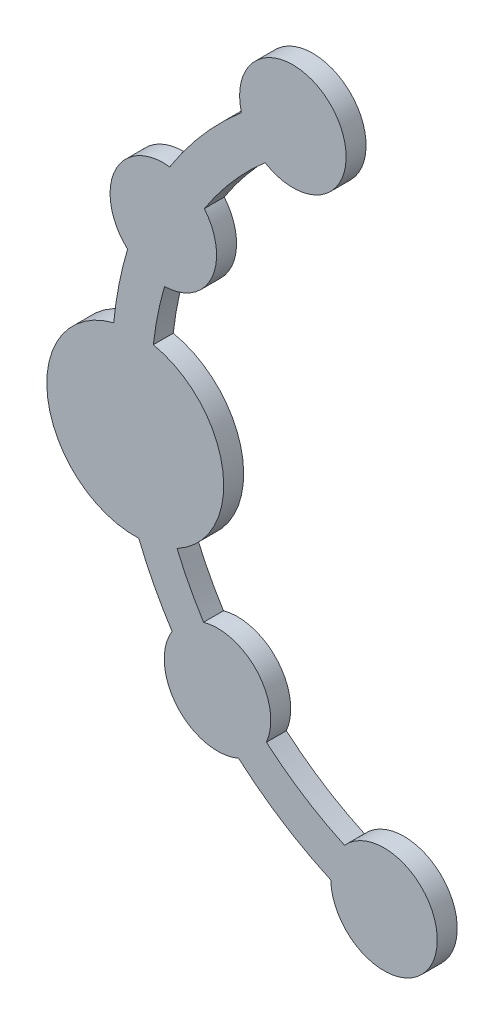
ISO-10303-21;
HEADER;
FILE_DESCRIPTION(('STEP AP214'),'2;1');
FILE_NAME('part.step','',(''),(''),'','','');
FILE_SCHEMA(('AUTOMOTIVE_DESIGN { 1 0 10303 214 1 1 1 1 }'));
ENDSEC;
DATA;
#1=APPLICATION_CONTEXT('core data for automotive mechanical design processes');
#2=APPLICATION_PROTOCOL_DEFINITION('international standard','automotive_design',2000,#1);
#3=PRODUCT_CONTEXT('',#1,'mechanical');
#4=PRODUCT('Part','Part','',(#3));
#5=PRODUCT_RELATED_PRODUCT_CATEGORY('part','',(#4));
#6=PRODUCT_DEFINITION_FORMATION('','',#4);
#7=PRODUCT_DEFINITION_CONTEXT('part definition',#1,'design');
#8=PRODUCT_DEFINITION('design','',#6,#7);
#9=PRODUCT_DEFINITION_SHAPE('','',#8);
#10=(LENGTH_UNIT() NAMED_UNIT(*) SI_UNIT(.MILLI.,.METRE.));
#11=(NAMED_UNIT(*) PLANE_ANGLE_UNIT() SI_UNIT($,.RADIAN.));
#12=(NAMED_UNIT(*) SI_UNIT($,.STERADIAN.) SOLID_ANGLE_UNIT());
#13=UNCERTAINTY_MEASURE_WITH_UNIT(LENGTH_MEASURE(1.E-05),#10,'distance_accuracy_value','');
#14=(GEOMETRIC_REPRESENTATION_CONTEXT(3) GLOBAL_UNCERTAINTY_ASSIGNED_CONTEXT((#13)) GLOBAL_UNIT_ASSIGNED_CONTEXT((#10,
#11,#12)) REPRESENTATION_CONTEXT('',''));
#15=CARTESIAN_POINT('',(0.,0.,0.));
#16=DIRECTION('',(0.,0.,1.));
#17=DIRECTION('',(1.,0.,0.));
#18=AXIS2_PLACEMENT_3D('',#15,#16,#17);
#19=CARTESIAN_POINT('',(0.,0.,0.));
#20=DIRECTION('',(0.,0.,1.));
#21=DIRECTION('',(1.,0.,0.));
#22=AXIS2_PLACEMENT_3D('',#19,#20,#21);
#23=CYLINDRICAL_SURFACE('',#22,37.75);
#24=CARTESIAN_POINT('',(0.,0.,2.03));
#25=DIRECTION('',(0.,0.,1.));
#26=DIRECTION('',(1.,0.,0.));
#27=AXIS2_PLACEMENT_3D('',#24,#25,#26);
#28=CIRCLE('',#27,37.75);
#29=CARTESIAN_POINT('',(-36.1659087125496,10.8207923460127,2.03));
#30=VERTEX_POINT('',#29);
#31=CARTESIAN_POINT('',(-37.5750307406949,3.6303670387208,2.03));
#32=VERTEX_POINT('',#31);
#33=EDGE_CURVE('E51',#30,#32,#28,.T.);
#34=ORIENTED_EDGE('',*,*,#33,.F.);
#35=DIRECTION('',(0.,0.,-1.));
#36=VECTOR('',#35,1.);
#37=CARTESIAN_POINT('',(-36.1659087125496,10.8207923460127,1.015));
#38=LINE('',#37,#36);
#39=CARTESIAN_POINT('',(-36.1659087125496,10.8207923460127,0.));
#40=VERTEX_POINT('',#39);
#41=EDGE_CURVE('E191',#30,#40,#38,.T.);
#42=ORIENTED_EDGE('',*,*,#41,.T.);
#43=CARTESIAN_POINT('',(0.,0.,0.));
#44=DIRECTION('',(0.,0.,1.));
#45=DIRECTION('',(1.,0.,0.));
#46=AXIS2_PLACEMENT_3D('',#43,#44,#45);
#47=CIRCLE('',#46,37.75);
#48=CARTESIAN_POINT('',(-37.5750307406949,3.6303670387208,0.));
#49=VERTEX_POINT('',#48);
#50=EDGE_CURVE('E158',#40,#49,#47,.T.);
#51=ORIENTED_EDGE('',*,*,#50,.T.);
#52=DIRECTION('',(0.,0.,-1.));
#53=VECTOR('',#52,1.);
#54=CARTESIAN_POINT('',(-37.5750307406949,3.6303670387208,1.015));
#55=LINE('',#54,#53);
#56=EDGE_CURVE('E219',#49,#32,#55,.F.);
#57=ORIENTED_EDGE('',*,*,#56,.T.);
#58=EDGE_LOOP('',(#34,#42,#51,#57));
#59=FACE_BOUND('',#58,.T.);
#60=ADVANCED_FACE('F36',(#59),#23,.T.);
#61=CARTESIAN_POINT('',(-24.5781736222649,28.6526766881177,0.));
#62=VERTEX_POINT('',#61);
#63=CARTESIAN_POINT('',(-31.8794195866251,20.2179402219885,0.));
#64=VERTEX_POINT('',#63);
#65=EDGE_CURVE('E150',#62,#64,#47,.T.);
#66=ORIENTED_EDGE('',*,*,#65,.T.);
#67=DIRECTION('',(0.,0.,-1.));
#68=VECTOR('',#67,1.);
#69=CARTESIAN_POINT('',(-31.8794195866251,20.2179402219885,1.015));
#70=LINE('',#69,#68);
#71=CARTESIAN_POINT('',(-31.8794195866251,20.2179402219885,2.03));
#72=VERTEX_POINT('',#71);
#73=EDGE_CURVE('E59',#64,#72,#70,.F.);
#74=ORIENTED_EDGE('',*,*,#73,.T.);
#75=CARTESIAN_POINT('',(-24.5781736222649,28.6526766881177,2.03));
#76=VERTEX_POINT('',#75);
#77=EDGE_CURVE('E164',#76,#72,#28,.T.);
#78=ORIENTED_EDGE('',*,*,#77,.F.);
#79=DIRECTION('',(0.,0.,1.));
#80=VECTOR('',#79,1.);
#81=CARTESIAN_POINT('',(-24.5781736222649,28.6526766881177,0.));
#82=LINE('',#81,#80);
#83=EDGE_CURVE('E162',#62,#76,#82,.T.);
#84=ORIENTED_EDGE('',*,*,#83,.F.);
#85=EDGE_LOOP('',(#66,#74,#78,#84));
#86=FACE_BOUND('',#85,.T.);
#87=ADVANCED_FACE('F163',(#86),#23,.T.);
#88=CARTESIAN_POINT('',(0.,0.,0.));
#89=DIRECTION('',(0.,0.,1.));
#90=DIRECTION('',(1.,0.,0.));
#91=AXIS2_PLACEMENT_3D('',#88,#89,#90);
#92=CYLINDRICAL_SURFACE('',#91,33.75);
#93=CARTESIAN_POINT('',(0.,0.,0.));
#94=DIRECTION('',(0.,0.,-1.));
#95=DIRECTION('',(1.,0.,0.));
#96=AXIS2_PLACEMENT_3D('',#93,#94,#95);
#97=CIRCLE('',#96,33.75);
#98=CARTESIAN_POINT('',(-33.5453464398065,3.71109582648624,0.));
#99=VERTEX_POINT('',#98);
#100=CARTESIAN_POINT('',(-32.4093475244958,9.41789217587786,0.));
#101=VERTEX_POINT('',#100);
#102=EDGE_CURVE('E229',#99,#101,#97,.T.);
#103=ORIENTED_EDGE('',*,*,#102,.T.);
#104=DIRECTION('',(0.,0.,-1.));
#105=VECTOR('',#104,1.);
#106=CARTESIAN_POINT('',(-32.4093475244958,9.41789217587786,1.015));
#107=LINE('',#106,#105);
#108=CARTESIAN_POINT('',(-32.4093475244958,9.41789217587786,2.03));
#109=VERTEX_POINT('',#108);
#110=EDGE_CURVE('E188',#101,#109,#107,.F.);
#111=ORIENTED_EDGE('',*,*,#110,.T.);
#112=CARTESIAN_POINT('',(0.,0.,2.03));
#113=DIRECTION('',(0.,0.,-1.));
#114=DIRECTION('',(1.,0.,0.));
#115=AXIS2_PLACEMENT_3D('',#112,#113,#114);
#116=CIRCLE('',#115,33.75);
#117=CARTESIAN_POINT('',(-33.5453464398065,3.71109582648624,2.03));
#118=VERTEX_POINT('',#117);
#119=EDGE_CURVE('E237',#118,#109,#116,.T.);
#120=ORIENTED_EDGE('',*,*,#119,.F.);
#121=DIRECTION('',(0.,0.,-1.));
#122=VECTOR('',#121,1.);
#123=CARTESIAN_POINT('',(-33.5453464398065,3.71109582648624,1.015));
#124=LINE('',#123,#122);
#125=EDGE_CURVE('E44',#118,#99,#124,.T.);
#126=ORIENTED_EDGE('',*,*,#125,.T.);
#127=EDGE_LOOP('',(#103,#111,#120,#126));
#128=FACE_BOUND('',#127,.T.);
#129=ADVANCED_FACE('F252',(#128),#92,.F.);
#130=CARTESIAN_POINT('',(-28.3574490931425,18.3007535618027,2.03));
#131=VERTEX_POINT('',#130);
#132=CARTESIAN_POINT('',(-22.1760107652679,25.4418365402092,2.03));
#133=VERTEX_POINT('',#132);
#134=EDGE_CURVE('E231',#131,#133,#116,.T.);
#135=ORIENTED_EDGE('',*,*,#134,.F.);
#136=DIRECTION('',(0.,0.,-1.));
#137=VECTOR('',#136,1.);
#138=CARTESIAN_POINT('',(-28.3574490931425,18.3007535618027,1.015));
#139=LINE('',#138,#137);
#140=CARTESIAN_POINT('',(-28.3574490931425,18.3007535618027,0.));
#141=VERTEX_POINT('',#140);
#142=EDGE_CURVE('E185',#131,#141,#139,.T.);
#143=ORIENTED_EDGE('',*,*,#142,.T.);
#144=CARTESIAN_POINT('',(-22.1760107652679,25.4418365402092,0.));
#145=VERTEX_POINT('',#144);
#146=EDGE_CURVE('E157',#141,#145,#97,.T.);
#147=ORIENTED_EDGE('',*,*,#146,.T.);
#148=DIRECTION('',(0.,0.,1.));
#149=VECTOR('',#148,1.);
#150=CARTESIAN_POINT('',(-22.1760107652679,25.4418365402092,0.));
#151=LINE('',#150,#149);
#152=EDGE_CURVE('E169',#145,#133,#151,.T.);
#153=ORIENTED_EDGE('',*,*,#152,.T.);
#154=EDGE_LOOP('',(#135,#143,#147,#153));
#155=FACE_BOUND('',#154,.T.);
#156=ADVANCED_FACE('F263',(#155),#92,.F.);
#157=CARTESIAN_POINT('',(-24.8740100130373,-28.396234360762,2.03));
#158=VERTEX_POINT('',#157);
#159=CARTESIAN_POINT('',(-15.4883469459397,-34.4263505019368,2.03));
#160=VERTEX_POINT('',#159);
#161=EDGE_CURVE('E223',#158,#160,#28,.T.);
#162=ORIENTED_EDGE('',*,*,#161,.F.);
#163=DIRECTION('',(0.,0.,-1.));
#164=VECTOR('',#163,1.);
#165=CARTESIAN_POINT('',(-24.8740100130373,-28.396234360762,1.015));
#166=LINE('',#165,#164);
#167=CARTESIAN_POINT('',(-24.8740100130373,-28.396234360762,0.));
#168=VERTEX_POINT('',#167);
#169=EDGE_CURVE('E208',#158,#168,#166,.T.);
#170=ORIENTED_EDGE('',*,*,#169,.T.);
#171=CARTESIAN_POINT('',(-15.4883469459397,-34.4263505019368,0.));
#172=VERTEX_POINT('',#171);
#173=EDGE_CURVE('E235',#168,#172,#47,.T.);
#174=ORIENTED_EDGE('',*,*,#173,.T.);
#175=DIRECTION('',(0.,0.,1.));
#176=VECTOR('',#175,1.);
#177=CARTESIAN_POINT('',(-15.4883469459397,-34.4263505019368,0.));
#178=LINE('',#177,#176);
#179=EDGE_CURVE('E227',#172,#160,#178,.T.);
#180=ORIENTED_EDGE('',*,*,#179,.T.);
#181=EDGE_LOOP('',(#162,#170,#174,#180));
#182=FACE_BOUND('',#181,.T.);
#183=ADVANCED_FACE('F294',(#182),#23,.T.);
#184=CARTESIAN_POINT('',(-35.021248964734,-14.0916507531984,0.));
#185=VERTEX_POINT('',#184);
#186=CARTESIAN_POINT('',(-31.6393033547216,-20.5916726670736,0.));
#187=VERTEX_POINT('',#186);
#188=EDGE_CURVE('E160',#185,#187,#47,.T.);
#189=ORIENTED_EDGE('',*,*,#188,.T.);
#190=DIRECTION('',(0.,0.,-1.));
#191=VECTOR('',#190,1.);
#192=CARTESIAN_POINT('',(-31.6393033547216,-20.5916726670736,1.015));
#193=LINE('',#192,#191);
#194=CARTESIAN_POINT('',(-31.6393033547216,-20.5916726670736,2.03));
#195=VERTEX_POINT('',#194);
#196=EDGE_CURVE('E206',#187,#195,#193,.F.);
#197=ORIENTED_EDGE('',*,*,#196,.T.);
#198=CARTESIAN_POINT('',(-35.021248964734,-14.0916507531984,2.03));
#199=VERTEX_POINT('',#198);
#200=EDGE_CURVE('E232',#199,#195,#28,.T.);
#201=ORIENTED_EDGE('',*,*,#200,.F.);
#202=DIRECTION('',(0.,0.,-1.));
#203=VECTOR('',#202,1.);
#204=CARTESIAN_POINT('',(-35.021248964734,-14.0916507531984,1.015));
#205=LINE('',#204,#203);
#206=EDGE_CURVE('E221',#199,#185,#205,.T.);
#207=ORIENTED_EDGE('',*,*,#206,.T.);
#208=EDGE_LOOP('',(#189,#197,#201,#207));
#209=FACE_BOUND('',#208,.T.);
#210=ADVANCED_FACE('F286',(#209),#23,.T.);
#211=CARTESIAN_POINT('',(-14.0904718331514,-30.6679165174155,0.));
#212=VERTEX_POINT('',#211);
#213=CARTESIAN_POINT('',(-22.0366357753982,-25.5626521257564,0.));
#214=VERTEX_POINT('',#213);
#215=EDGE_CURVE('E225',#212,#214,#97,.T.);
#216=ORIENTED_EDGE('',*,*,#215,.T.);
#217=DIRECTION('',(0.,0.,-1.));
#218=VECTOR('',#217,1.);
#219=CARTESIAN_POINT('',(-22.0366357753982,-25.5626521257564,1.015));
#220=LINE('',#219,#218);
#221=CARTESIAN_POINT('',(-22.0366357753982,-25.5626521257564,2.03));
#222=VERTEX_POINT('',#221);
#223=EDGE_CURVE('E204',#214,#222,#220,.F.);
#224=ORIENTED_EDGE('',*,*,#223,.T.);
#225=CARTESIAN_POINT('',(-14.0904718331514,-30.6679165174155,2.03));
#226=VERTEX_POINT('',#225);
#227=EDGE_CURVE('E233',#226,#222,#116,.T.);
#228=ORIENTED_EDGE('',*,*,#227,.F.);
#229=DIRECTION('',(0.,0.,1.));
#230=VECTOR('',#229,1.);
#231=CARTESIAN_POINT('',(-14.0904718331514,-30.6679165174155,0.));
#232=LINE('',#231,#230);
#233=EDGE_CURVE('E240',#212,#226,#232,.T.);
#234=ORIENTED_EDGE('',*,*,#233,.F.);
#235=EDGE_LOOP('',(#216,#224,#228,#234));
#236=FACE_BOUND('',#235,.T.);
#237=ADVANCED_FACE('F299',(#236),#92,.F.);
#238=CARTESIAN_POINT('',(-28.4316785886476,-18.1852179704241,2.03));
#239=VERTEX_POINT('',#238);
#240=CARTESIAN_POINT('',(-31.1327234183602,-13.0313480713197,2.03));
#241=VERTEX_POINT('',#240);
#242=EDGE_CURVE('E236',#239,#241,#116,.T.);
#243=ORIENTED_EDGE('',*,*,#242,.F.);
#244=DIRECTION('',(0.,0.,-1.));
#245=VECTOR('',#244,1.);
#246=CARTESIAN_POINT('',(-28.4316785886476,-18.1852179704241,1.015));
#247=LINE('',#246,#245);
#248=CARTESIAN_POINT('',(-28.4316785886476,-18.1852179704241,0.));
#249=VERTEX_POINT('',#248);
#250=EDGE_CURVE('E201',#239,#249,#247,.T.);
#251=ORIENTED_EDGE('',*,*,#250,.T.);
#252=CARTESIAN_POINT('',(-31.1327234183602,-13.0313480713197,0.));
#253=VERTEX_POINT('',#252);
#254=EDGE_CURVE('E228',#249,#253,#97,.T.);
#255=ORIENTED_EDGE('',*,*,#254,.T.);
#256=DIRECTION('',(0.,0.,-1.));
#257=VECTOR('',#256,1.);
#258=CARTESIAN_POINT('',(-31.1327234183602,-13.0313480713197,1.015));
#259=LINE('',#258,#257);
#260=EDGE_CURVE('E11',#253,#241,#259,.F.);
#261=ORIENTED_EDGE('',*,*,#260,.T.);
#262=EDGE_LOOP('',(#243,#251,#255,#261));
#263=FACE_BOUND('',#262,.T.);
#264=ADVANCED_FACE('F306',(#263),#92,.F.);
#265=CARTESIAN_POINT('',(-10.0697618662976,-34.3025129685284,2.03));
#266=DIRECTION('',(0.,0.,-1.));
#267=DIRECTION('',(-1.,0.,0.));
#268=AXIS2_PLACEMENT_3D('',#265,#266,#267);
#269=CYLINDRICAL_SURFACE('',#268,5.42000000000002);
#270=CARTESIAN_POINT('',(-10.0697618662976,-34.3025129685284,2.03));
#271=DIRECTION('',(0.,0.,1.));
#272=DIRECTION('',(1.,0.,0.));
#273=AXIS2_PLACEMENT_3D('',#270,#271,#272);
#274=CIRCLE('',#273,5.42000000000002);
#275=EDGE_CURVE('E245',#160,#226,#274,.T.);
#276=ORIENTED_EDGE('',*,*,#275,.F.);
#277=ORIENTED_EDGE('',*,*,#179,.F.);
#278=CARTESIAN_POINT('',(-10.0697618662976,-34.3025129685284,0.));
#279=DIRECTION('',(0.,0.,1.));
#280=DIRECTION('',(1.,0.,0.));
#281=AXIS2_PLACEMENT_3D('',#278,#279,#280);
#282=CIRCLE('',#281,5.42000000000002);
#283=EDGE_CURVE('E168',#172,#212,#282,.T.);
#284=ORIENTED_EDGE('',*,*,#283,.T.);
#285=ORIENTED_EDGE('',*,*,#233,.T.);
#286=EDGE_LOOP('',(#276,#277,#284,#285));
#287=FACE_BOUND('',#286,.T.);
#288=ADVANCED_FACE('F38',(#287),#269,.T.);
#289=CARTESIAN_POINT('',(-10.0697618662976,-34.3025129685284,2.03));
#290=DIRECTION('',(0.,0.,1.));
#291=DIRECTION('',(1.,0.,0.));
#292=AXIS2_PLACEMENT_3D('',#289,#290,#291);
#293=PLANE('',#292);
#294=ORIENTED_EDGE('',*,*,#134,.T.);
#295=CARTESIAN_POINT('',(-19.3450847635356,30.0637688171597,2.03));
#296=DIRECTION('',(0.,0.,1.));
#297=DIRECTION('',(1.,0.,0.));
#298=AXIS2_PLACEMENT_3D('',#295,#296,#297);
#299=CIRCLE('',#298,5.42);
#300=EDGE_CURVE('E174',#133,#76,#299,.T.);
#301=ORIENTED_EDGE('',*,*,#300,.T.);
#302=ORIENTED_EDGE('',*,*,#77,.T.);
#303=CARTESIAN_POINT('',(-32.5259384518664,14.8366380229955,2.03));
#304=DIRECTION('',(0.,0.,1.));
#305=DIRECTION('',(1.,0.,0.));
#306=AXIS2_PLACEMENT_3D('',#303,#304,#305);
#307=CIRCLE('',#306,5.42);
#308=EDGE_CURVE('E182',#72,#30,#307,.T.);
#309=ORIENTED_EDGE('',*,*,#308,.T.);
#310=ORIENTED_EDGE('',*,*,#33,.T.);
#311=CARTESIAN_POINT('',(-35.3845002549534,-5.09898437997218,2.03));
#312=DIRECTION('',(0.,0.,1.));
#313=DIRECTION('',(1.,0.,0.));
#314=AXIS2_PLACEMENT_3D('',#311,#312,#313);
#315=CIRCLE('',#314,9.);
#316=EDGE_CURVE('E215',#32,#199,#315,.T.);
#317=ORIENTED_EDGE('',*,*,#316,.T.);
#318=ORIENTED_EDGE('',*,*,#200,.T.);
#319=CARTESIAN_POINT('',(-27.0135892978425,-23.4164150383335,2.03));
#320=DIRECTION('',(0.,0.,1.));
#321=DIRECTION('',(1.,0.,0.));
#322=AXIS2_PLACEMENT_3D('',#319,#320,#321);
#323=CIRCLE('',#322,5.42);
#324=EDGE_CURVE('E197',#195,#158,#323,.T.);
#325=ORIENTED_EDGE('',*,*,#324,.T.);
#326=ORIENTED_EDGE('',*,*,#161,.T.);
#327=ORIENTED_EDGE('',*,*,#275,.T.);
#328=ORIENTED_EDGE('',*,*,#227,.T.);
#329=EDGE_CURVE('E194',#222,#239,#323,.T.);
#330=ORIENTED_EDGE('',*,*,#329,.T.);
#331=ORIENTED_EDGE('',*,*,#242,.T.);
#332=EDGE_CURVE('E212',#241,#118,#315,.T.);
#333=ORIENTED_EDGE('',*,*,#332,.T.);
#334=ORIENTED_EDGE('',*,*,#119,.T.);
#335=EDGE_CURVE('E179',#109,#131,#307,.T.);
#336=ORIENTED_EDGE('',*,*,#335,.T.);
#337=EDGE_LOOP('',(#294,#301,#302,#309,#310,#317,#318,#325,#326,#327,#328,#330,#331,#333,#334,#336));
#338=FACE_BOUND('',#337,.T.);
#339=ADVANCED_FACE('F269',(#338),#293,.T.);
#340=CARTESIAN_POINT('',(-10.0697618662976,-34.3025129685284,0.));
#341=DIRECTION('',(0.,0.,1.));
#342=DIRECTION('',(1.,0.,0.));
#343=AXIS2_PLACEMENT_3D('',#340,#341,#342);
#344=PLANE('',#343);
#345=ORIENTED_EDGE('',*,*,#65,.F.);
#346=CARTESIAN_POINT('',(-19.3450847635356,30.0637688171597,0.));
#347=DIRECTION('',(0.,0.,1.));
#348=DIRECTION('',(1.,0.,0.));
#349=AXIS2_PLACEMENT_3D('',#346,#347,#348);
#350=CIRCLE('',#349,5.42);
#351=EDGE_CURVE('E154',#145,#62,#350,.T.);
#352=ORIENTED_EDGE('',*,*,#351,.F.);
#353=ORIENTED_EDGE('',*,*,#146,.F.);
#354=CARTESIAN_POINT('',(-32.5259384518664,14.8366380229955,0.));
#355=DIRECTION('',(0.,0.,1.));
#356=DIRECTION('',(1.,0.,0.));
#357=AXIS2_PLACEMENT_3D('',#354,#355,#356);
#358=CIRCLE('',#357,5.42);
#359=EDGE_CURVE('E176',#101,#141,#358,.T.);
#360=ORIENTED_EDGE('',*,*,#359,.F.);
#361=ORIENTED_EDGE('',*,*,#102,.F.);
#362=CARTESIAN_POINT('',(-35.3845002549534,-5.09898437997218,0.));
#363=DIRECTION('',(0.,0.,1.));
#364=DIRECTION('',(1.,0.,0.));
#365=AXIS2_PLACEMENT_3D('',#362,#363,#364);
#366=CIRCLE('',#365,9.);
#367=EDGE_CURVE('E211',#253,#99,#366,.T.);
#368=ORIENTED_EDGE('',*,*,#367,.F.);
#369=ORIENTED_EDGE('',*,*,#254,.F.);
#370=CARTESIAN_POINT('',(-27.0135892978425,-23.4164150383335,0.));
#371=DIRECTION('',(0.,0.,1.));
#372=DIRECTION('',(1.,0.,0.));
#373=AXIS2_PLACEMENT_3D('',#370,#371,#372);
#374=CIRCLE('',#373,5.42);
#375=EDGE_CURVE('E193',#214,#249,#374,.T.);
#376=ORIENTED_EDGE('',*,*,#375,.F.);
#377=ORIENTED_EDGE('',*,*,#215,.F.);
#378=ORIENTED_EDGE('',*,*,#283,.F.);
#379=ORIENTED_EDGE('',*,*,#173,.F.);
#380=EDGE_CURVE('E198',#187,#168,#374,.T.);
#381=ORIENTED_EDGE('',*,*,#380,.F.);
#382=ORIENTED_EDGE('',*,*,#188,.F.);
#383=EDGE_CURVE('E216',#49,#185,#366,.T.);
#384=ORIENTED_EDGE('',*,*,#383,.F.);
#385=ORIENTED_EDGE('',*,*,#50,.F.);
#386=EDGE_CURVE('E156',#64,#40,#358,.T.);
#387=ORIENTED_EDGE('',*,*,#386,.F.);
#388=EDGE_LOOP('',(#345,#352,#353,#360,#361,#368,#369,#376,#377,#378,#379,#381,#382,#384,#385,#387));
#389=FACE_BOUND('',#388,.T.);
#390=ADVANCED_FACE('F152',(#389),#344,.F.);
#391=CARTESIAN_POINT('',(-35.3845002549534,-5.09898437997218,2.03));
#392=DIRECTION('',(0.,0.,-1.));
#393=DIRECTION('',(-1.,0.,0.));
#394=AXIS2_PLACEMENT_3D('',#391,#392,#393);
#395=CYLINDRICAL_SURFACE('',#394,9.);
#396=ORIENTED_EDGE('',*,*,#260,.F.);
#397=ORIENTED_EDGE('',*,*,#367,.T.);
#398=ORIENTED_EDGE('',*,*,#125,.F.);
#399=ORIENTED_EDGE('',*,*,#332,.F.);
#400=EDGE_LOOP('',(#396,#397,#398,#399));
#401=FACE_BOUND('',#400,.T.);
#402=ADVANCED_FACE('F259',(#401),#395,.T.);
#403=ORIENTED_EDGE('',*,*,#206,.F.);
#404=ORIENTED_EDGE('',*,*,#316,.F.);
#405=ORIENTED_EDGE('',*,*,#56,.F.);
#406=ORIENTED_EDGE('',*,*,#383,.T.);
#407=EDGE_LOOP('',(#403,#404,#405,#406));
#408=FACE_BOUND('',#407,.T.);
#409=ADVANCED_FACE('F280',(#408),#395,.T.);
#410=CARTESIAN_POINT('',(-27.0135892978425,-23.4164150383335,2.03));
#411=DIRECTION('',(0.,0.,-1.));
#412=DIRECTION('',(-1.,0.,0.));
#413=AXIS2_PLACEMENT_3D('',#410,#411,#412);
#414=CYLINDRICAL_SURFACE('',#413,5.42);
#415=ORIENTED_EDGE('',*,*,#223,.F.);
#416=ORIENTED_EDGE('',*,*,#375,.T.);
#417=ORIENTED_EDGE('',*,*,#250,.F.);
#418=ORIENTED_EDGE('',*,*,#329,.F.);
#419=EDGE_LOOP('',(#415,#416,#417,#418));
#420=FACE_BOUND('',#419,.T.);
#421=ADVANCED_FACE('F303',(#420),#414,.T.);
#422=ORIENTED_EDGE('',*,*,#169,.F.);
#423=ORIENTED_EDGE('',*,*,#324,.F.);
#424=ORIENTED_EDGE('',*,*,#196,.F.);
#425=ORIENTED_EDGE('',*,*,#380,.T.);
#426=EDGE_LOOP('',(#422,#423,#424,#425));
#427=FACE_BOUND('',#426,.T.);
#428=ADVANCED_FACE('F383',(#427),#414,.T.);
#429=CARTESIAN_POINT('',(-32.5259384518664,14.8366380229955,2.03));
#430=DIRECTION('',(0.,0.,-1.));
#431=DIRECTION('',(-1.,0.,0.));
#432=AXIS2_PLACEMENT_3D('',#429,#430,#431);
#433=CYLINDRICAL_SURFACE('',#432,5.42);
#434=ORIENTED_EDGE('',*,*,#110,.F.);
#435=ORIENTED_EDGE('',*,*,#359,.T.);
#436=ORIENTED_EDGE('',*,*,#142,.F.);
#437=ORIENTED_EDGE('',*,*,#335,.F.);
#438=EDGE_LOOP('',(#434,#435,#436,#437));
#439=FACE_BOUND('',#438,.T.);
#440=ADVANCED_FACE('F267',(#439),#433,.T.);
#441=ORIENTED_EDGE('',*,*,#41,.F.);
#442=ORIENTED_EDGE('',*,*,#308,.F.);
#443=ORIENTED_EDGE('',*,*,#73,.F.);
#444=ORIENTED_EDGE('',*,*,#386,.T.);
#445=EDGE_LOOP('',(#441,#442,#443,#444));
#446=FACE_BOUND('',#445,.T.);
#447=ADVANCED_FACE('F273',(#446),#433,.T.);
#448=CARTESIAN_POINT('',(-19.3450847635356,30.0637688171597,2.03));
#449=DIRECTION('',(0.,0.,-1.));
#450=DIRECTION('',(-1.,0.,0.));
#451=AXIS2_PLACEMENT_3D('',#448,#449,#450);
#452=CYLINDRICAL_SURFACE('',#451,5.42);
#453=ORIENTED_EDGE('',*,*,#152,.F.);
#454=ORIENTED_EDGE('',*,*,#351,.T.);
#455=ORIENTED_EDGE('',*,*,#83,.T.);
#456=ORIENTED_EDGE('',*,*,#300,.F.);
#457=EDGE_LOOP('',(#453,#454,#455,#456));
#458=FACE_BOUND('',#457,.T.);
#459=ADVANCED_FACE('F172',(#458),#452,.T.);
#460=CLOSED_SHELL('',(#60,#87,#129,#156,#183,#210,#237,#264,#288,#339,#390,#402,#409,#421,#428,
#440,#447,#459));
#461=MANIFOLD_SOLID_BREP('B2',#460);
#462=ADVANCED_BREP_SHAPE_REPRESENTATION('',(#18,#461),#14);
#463=SHAPE_DEFINITION_REPRESENTATION(#9,#462);
ENDSEC;
END-ISO-10303-21;
